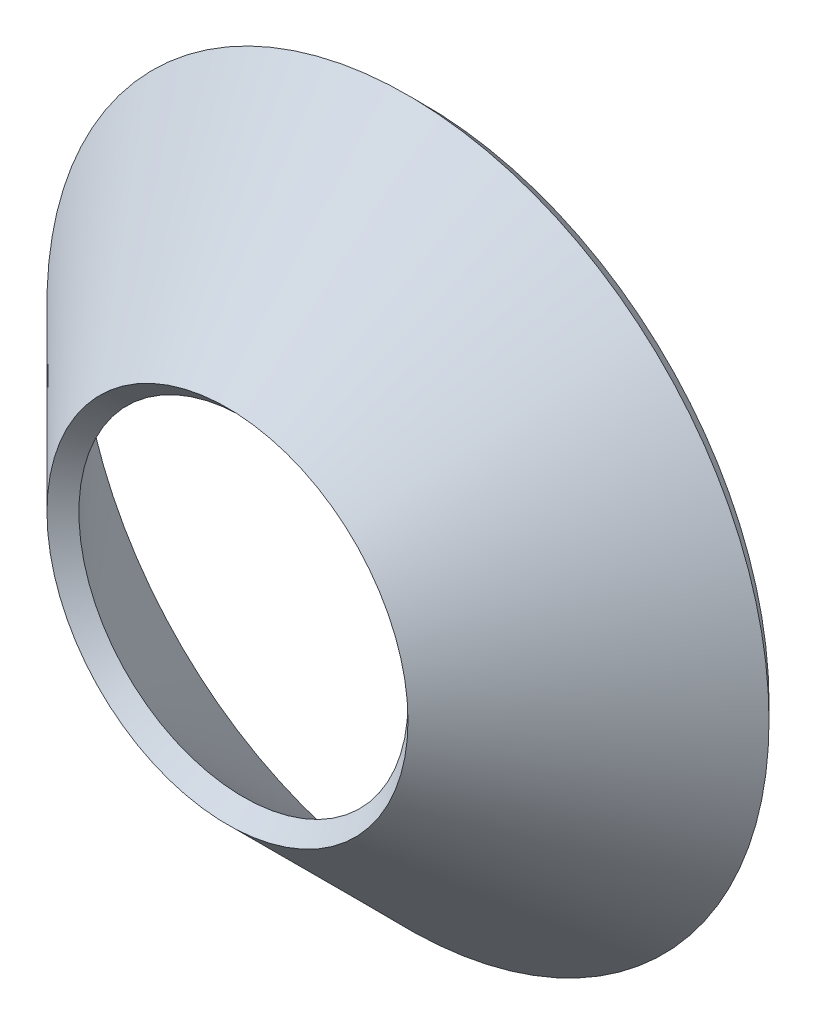
ISO-10303-21;
HEADER;
FILE_DESCRIPTION(('STEP AP214'),'2;1');
FILE_NAME('part.step','',(''),(''),'','','');
FILE_SCHEMA(('AUTOMOTIVE_DESIGN { 1 0 10303 214 1 1 1 1 }'));
ENDSEC;
DATA;
#1=APPLICATION_CONTEXT('core data for automotive mechanical design processes');
#2=APPLICATION_PROTOCOL_DEFINITION('international standard','automotive_design',2000,#1);
#3=PRODUCT_CONTEXT('',#1,'mechanical');
#4=PRODUCT('Part','Part','',(#3));
#5=PRODUCT_RELATED_PRODUCT_CATEGORY('part','',(#4));
#6=PRODUCT_DEFINITION_FORMATION('','',#4);
#7=PRODUCT_DEFINITION_CONTEXT('part definition',#1,'design');
#8=PRODUCT_DEFINITION('design','',#6,#7);
#9=PRODUCT_DEFINITION_SHAPE('','',#8);
#10=(LENGTH_UNIT() NAMED_UNIT(*) SI_UNIT(.MILLI.,.METRE.));
#11=(NAMED_UNIT(*) PLANE_ANGLE_UNIT() SI_UNIT($,.RADIAN.));
#12=(NAMED_UNIT(*) SI_UNIT($,.STERADIAN.) SOLID_ANGLE_UNIT());
#13=UNCERTAINTY_MEASURE_WITH_UNIT(LENGTH_MEASURE(1.E-05),#10,'distance_accuracy_value','');
#14=(GEOMETRIC_REPRESENTATION_CONTEXT(3) GLOBAL_UNCERTAINTY_ASSIGNED_CONTEXT((#13)) GLOBAL_UNIT_ASSIGNED_CONTEXT((#10,
#11,#12)) REPRESENTATION_CONTEXT('',''));
#15=CARTESIAN_POINT('',(0.,0.,0.));
#16=DIRECTION('',(0.,0.,1.));
#17=DIRECTION('',(1.,0.,0.));
#18=AXIS2_PLACEMENT_3D('',#15,#16,#17);
#19=CARTESIAN_POINT('',(0.,0.,23.1549359697327));
#20=DIRECTION('',(0.,0.,-1.));
#21=DIRECTION('',(-1.,0.,0.));
#22=AXIS2_PLACEMENT_3D('',#19,#20,#21);
#23=CONICAL_SURFACE('',#22,23.1549359697327,0.785398163397454);
#24=CARTESIAN_POINT('',(0.,0.,-2.2450640302673));
#25=DIRECTION('',(0.,0.,1.));
#26=DIRECTION('',(1.,0.,0.));
#27=AXIS2_PLACEMENT_3D('',#24,#25,#26);
#28=CIRCLE('',#27,48.554935969733);
#29=CARTESIAN_POINT('',(48.554935969733,0.,-2.2450640302673));
#30=VERTEX_POINT('',#29);
#31=EDGE_CURVE('E60',#30,#30,#28,.T.);
#32=ORIENTED_EDGE('',*,*,#31,.F.);
#33=EDGE_LOOP('',(#32));
#34=FACE_BOUND('',#33,.T.);
#35=CARTESIAN_POINT('',(0.,0.,23.1549359697327));
#36=DIRECTION('',(0.,0.,1.));
#37=DIRECTION('',(1.,0.,0.));
#38=AXIS2_PLACEMENT_3D('',#35,#36,#37);
#39=CIRCLE('',#38,23.1549359697327);
#40=CARTESIAN_POINT('',(23.1549359697327,0.,23.1549359697327));
#41=VERTEX_POINT('',#40);
#42=EDGE_CURVE('E10',#41,#41,#39,.T.);
#43=ORIENTED_EDGE('',*,*,#42,.T.);
#44=EDGE_LOOP('',(#43));
#45=FACE_BOUND('',#44,.T.);
#46=ADVANCED_FACE('F43',(#34,#45),#23,.F.);
#47=CARTESIAN_POINT('',(0.,0.,23.1549359697327));
#48=DIRECTION('',(0.,0.,1.));
#49=DIRECTION('',(1.,0.,0.));
#50=AXIS2_PLACEMENT_3D('',#47,#48,#49);
#51=CONICAL_SURFACE('',#50,23.1549359697327,0.785398163397443);
#52=CARTESIAN_POINT('',(0.,0.,25.4));
#53=DIRECTION('',(0.,0.,1.));
#54=DIRECTION('',(1.,0.,0.));
#55=AXIS2_PLACEMENT_3D('',#52,#53,#54);
#56=CIRCLE('',#55,25.4);
#57=CARTESIAN_POINT('',(25.4,0.,25.4));
#58=VERTEX_POINT('',#57);
#59=EDGE_CURVE('E50',#58,#58,#56,.T.);
#60=ORIENTED_EDGE('',*,*,#59,.T.);
#61=EDGE_LOOP('',(#60));
#62=FACE_BOUND('',#61,.T.);
#63=ORIENTED_EDGE('',*,*,#42,.F.);
#64=EDGE_LOOP('',(#63));
#65=FACE_BOUND('',#64,.T.);
#66=ADVANCED_FACE('F71',(#62,#65),#51,.F.);
#67=CARTESIAN_POINT('',(0.,0.,25.4));
#68=DIRECTION('',(0.,0.,-1.));
#69=DIRECTION('',(-1.,0.,0.));
#70=AXIS2_PLACEMENT_3D('',#67,#68,#69);
#71=CONICAL_SURFACE('',#70,25.4,0.785398163397454);
#72=CARTESIAN_POINT('',(0.,0.,0.));
#73=DIRECTION('',(0.,0.,1.));
#74=DIRECTION('',(1.,0.,0.));
#75=AXIS2_PLACEMENT_3D('',#72,#73,#74);
#76=CIRCLE('',#75,50.8000000000003);
#77=CARTESIAN_POINT('',(50.8000000000003,0.,0.));
#78=VERTEX_POINT('',#77);
#79=EDGE_CURVE('E55',#78,#78,#76,.T.);
#80=ORIENTED_EDGE('',*,*,#79,.T.);
#81=EDGE_LOOP('',(#80));
#82=FACE_BOUND('',#81,.T.);
#83=ORIENTED_EDGE('',*,*,#59,.F.);
#84=EDGE_LOOP('',(#83));
#85=FACE_BOUND('',#84,.T.);
#86=ADVANCED_FACE('F75',(#82,#85),#71,.T.);
#87=CARTESIAN_POINT('',(0.,0.,0.));
#88=DIRECTION('',(0.,0.,1.));
#89=DIRECTION('',(1.,0.,0.));
#90=AXIS2_PLACEMENT_3D('',#87,#88,#89);
#91=CONICAL_SURFACE('',#90,50.8000000000003,0.785398163397444);
#92=ORIENTED_EDGE('',*,*,#31,.T.);
#93=EDGE_LOOP('',(#92));
#94=FACE_BOUND('',#93,.T.);
#95=ORIENTED_EDGE('',*,*,#79,.F.);
#96=EDGE_LOOP('',(#95));
#97=FACE_BOUND('',#96,.T.);
#98=ADVANCED_FACE('F67',(#94,#97),#91,.T.);
#99=CLOSED_SHELL('',(#46,#66,#86,#98));
#100=MANIFOLD_SOLID_BREP('B2',#99);
#101=ADVANCED_BREP_SHAPE_REPRESENTATION('',(#18,#100),#14);
#102=SHAPE_DEFINITION_REPRESENTATION(#9,#101);
ENDSEC;
END-ISO-10303-21;
